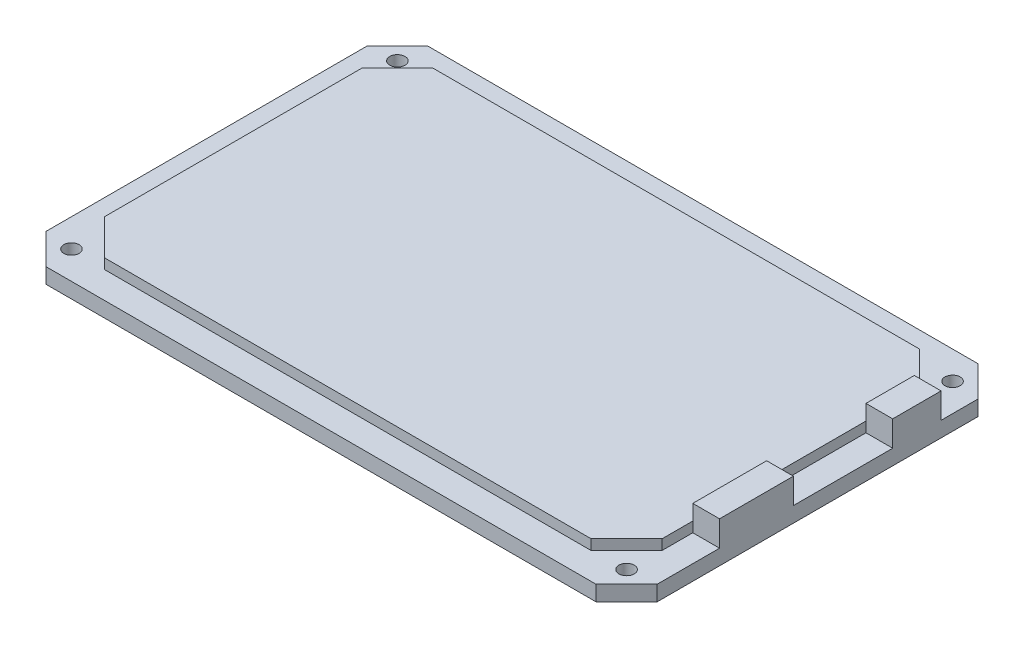
ISO-10303-21;
HEADER;
FILE_DESCRIPTION(('STEP AP214'),'2;1');
FILE_NAME('part.step','',(''),(''),'','','');
FILE_SCHEMA(('AUTOMOTIVE_DESIGN { 1 0 10303 214 1 1 1 1 }'));
ENDSEC;
DATA;
#1=APPLICATION_CONTEXT('core data for automotive mechanical design processes');
#2=APPLICATION_PROTOCOL_DEFINITION('international standard','automotive_design',2000,#1);
#3=PRODUCT_CONTEXT('',#1,'mechanical');
#4=PRODUCT('Part','Part','',(#3));
#5=PRODUCT_RELATED_PRODUCT_CATEGORY('part','',(#4));
#6=PRODUCT_DEFINITION_FORMATION('','',#4);
#7=PRODUCT_DEFINITION_CONTEXT('part definition',#1,'design');
#8=PRODUCT_DEFINITION('design','',#6,#7);
#9=PRODUCT_DEFINITION_SHAPE('','',#8);
#10=(LENGTH_UNIT() NAMED_UNIT(*) SI_UNIT(.MILLI.,.METRE.));
#11=(NAMED_UNIT(*) PLANE_ANGLE_UNIT() SI_UNIT($,.RADIAN.));
#12=(NAMED_UNIT(*) SI_UNIT($,.STERADIAN.) SOLID_ANGLE_UNIT());
#13=UNCERTAINTY_MEASURE_WITH_UNIT(LENGTH_MEASURE(1.E-05),#10,'distance_accuracy_value','');
#14=(GEOMETRIC_REPRESENTATION_CONTEXT(3) GLOBAL_UNCERTAINTY_ASSIGNED_CONTEXT((#13)) GLOBAL_UNIT_ASSIGNED_CONTEXT((#10,
#11,#12)) REPRESENTATION_CONTEXT('',''));
#15=CARTESIAN_POINT('',(0.,0.,0.));
#16=DIRECTION('',(0.,0.,1.));
#17=DIRECTION('',(1.,0.,0.));
#18=AXIS2_PLACEMENT_3D('',#15,#16,#17);
#19=CARTESIAN_POINT('',(0.,3.,0.));
#20=DIRECTION('',(0.,-1.,0.));
#21=DIRECTION('',(0.,0.,-1.));
#22=AXIS2_PLACEMENT_3D('',#19,#20,#21);
#23=PLANE('',#22);
#24=CARTESIAN_POINT('',(-54.5,3.,-32.));
#25=DIRECTION('',(0.,1.,0.));
#26=DIRECTION('',(0.,0.,1.));
#27=AXIS2_PLACEMENT_3D('',#24,#25,#26);
#28=CIRCLE('',#27,1.5);
#29=CARTESIAN_POINT('',(-54.5,3.,-30.5));
#30=VERTEX_POINT('',#29);
#31=EDGE_CURVE('E262',#30,#30,#28,.T.);
#32=ORIENTED_EDGE('',*,*,#31,.F.);
#33=EDGE_LOOP('',(#32));
#34=FACE_BOUND('',#33,.T.);
#35=CARTESIAN_POINT('',(54.5,3.,-32.));
#36=DIRECTION('',(0.,1.,0.));
#37=DIRECTION('',(0.,0.,1.));
#38=AXIS2_PLACEMENT_3D('',#35,#36,#37);
#39=CIRCLE('',#38,1.5);
#40=CARTESIAN_POINT('',(54.5,3.,-30.5));
#41=VERTEX_POINT('',#40);
#42=EDGE_CURVE('E266',#41,#41,#39,.T.);
#43=ORIENTED_EDGE('',*,*,#42,.F.);
#44=EDGE_LOOP('',(#43));
#45=FACE_BOUND('',#44,.T.);
#46=CARTESIAN_POINT('',(54.5,3.,32.));
#47=DIRECTION('',(0.,1.,0.));
#48=DIRECTION('',(0.,0.,1.));
#49=AXIS2_PLACEMENT_3D('',#46,#47,#48);
#50=CIRCLE('',#49,1.5);
#51=CARTESIAN_POINT('',(54.5,3.,33.5));
#52=VERTEX_POINT('',#51);
#53=EDGE_CURVE('E261',#52,#52,#50,.T.);
#54=ORIENTED_EDGE('',*,*,#53,.F.);
#55=EDGE_LOOP('',(#54));
#56=FACE_BOUND('',#55,.T.);
#57=CARTESIAN_POINT('',(-54.5,3.,32.));
#58=DIRECTION('',(0.,1.,0.));
#59=DIRECTION('',(0.,0.,1.));
#60=AXIS2_PLACEMENT_3D('',#57,#58,#59);
#61=CIRCLE('',#60,1.5);
#62=CARTESIAN_POINT('',(-54.5,3.,33.5));
#63=VERTEX_POINT('',#62);
#64=EDGE_CURVE('E271',#63,#63,#61,.T.);
#65=ORIENTED_EDGE('',*,*,#64,.F.);
#66=EDGE_LOOP('',(#65));
#67=FACE_BOUND('',#66,.T.);
#68=DIRECTION('',(1.,0.,0.));
#69=VECTOR('',#68,1.);
#70=CARTESIAN_POINT('',(54.75,3.,19.25));
#71=LINE('',#70,#69);
#72=CARTESIAN_POINT('',(54.75,3.,19.25));
#73=VERTEX_POINT('',#72);
#74=CARTESIAN_POINT('',(60.,3.,19.25));
#75=VERTEX_POINT('',#74);
#76=EDGE_CURVE('E459',#73,#75,#71,.T.);
#77=ORIENTED_EDGE('',*,*,#76,.F.);
#78=DIRECTION('',(0.,0.,-1.));
#79=VECTOR('',#78,1.);
#80=CARTESIAN_POINT('',(54.75,3.,32.25));
#81=LINE('',#80,#79);
#82=CARTESIAN_POINT('',(54.75,3.,25.25));
#83=VERTEX_POINT('',#82);
#84=EDGE_CURVE('E290',#83,#73,#81,.T.);
#85=ORIENTED_EDGE('',*,*,#84,.F.);
#86=DIRECTION('',(0.707106781186549,0.,-0.707106781186546));
#87=VECTOR('',#86,1.);
#88=CARTESIAN_POINT('',(39.9999999999999,3.,40.0000000000001));
#89=LINE('',#88,#87);
#90=CARTESIAN_POINT('',(47.75,3.,32.25));
#91=VERTEX_POINT('',#90);
#92=EDGE_CURVE('E11',#83,#91,#89,.F.);
#93=ORIENTED_EDGE('',*,*,#92,.T.);
#94=DIRECTION('',(1.,0.,0.));
#95=VECTOR('',#94,1.);
#96=CARTESIAN_POINT('',(-54.75,3.,32.25));
#97=LINE('',#96,#95);
#98=CARTESIAN_POINT('',(-47.75,3.,32.25));
#99=VERTEX_POINT('',#98);
#100=EDGE_CURVE('E301',#99,#91,#97,.T.);
#101=ORIENTED_EDGE('',*,*,#100,.F.);
#102=DIRECTION('',(0.707106781186546,0.,0.707106781186549));
#103=VECTOR('',#102,1.);
#104=CARTESIAN_POINT('',(-40.0000000000001,3.,39.9999999999999));
#105=LINE('',#104,#103);
#106=CARTESIAN_POINT('',(-54.75,3.,25.25));
#107=VERTEX_POINT('',#106);
#108=EDGE_CURVE('E42',#99,#107,#105,.F.);
#109=ORIENTED_EDGE('',*,*,#108,.T.);
#110=DIRECTION('',(0.,0.,1.));
#111=VECTOR('',#110,1.);
#112=CARTESIAN_POINT('',(-54.75,3.,32.25));
#113=LINE('',#112,#111);
#114=CARTESIAN_POINT('',(-54.75,3.,-25.25));
#115=VERTEX_POINT('',#114);
#116=EDGE_CURVE('E298',#115,#107,#113,.T.);
#117=ORIENTED_EDGE('',*,*,#116,.F.);
#118=DIRECTION('',(-0.707106781186549,0.,0.707106781186546));
#119=VECTOR('',#118,1.);
#120=CARTESIAN_POINT('',(-39.9999999999999,3.,-40.0000000000001));
#121=LINE('',#120,#119);
#122=CARTESIAN_POINT('',(-47.75,3.,-32.25));
#123=VERTEX_POINT('',#122);
#124=EDGE_CURVE('E399',#115,#123,#121,.F.);
#125=ORIENTED_EDGE('',*,*,#124,.T.);
#126=DIRECTION('',(-1.,0.,0.));
#127=VECTOR('',#126,1.);
#128=CARTESIAN_POINT('',(-54.75,3.,-32.25));
#129=LINE('',#128,#127);
#130=CARTESIAN_POINT('',(47.75,3.,-32.25));
#131=VERTEX_POINT('',#130);
#132=EDGE_CURVE('E293',#131,#123,#129,.T.);
#133=ORIENTED_EDGE('',*,*,#132,.F.);
#134=DIRECTION('',(-0.707106781186545,0.,-0.70710678118655));
#135=VECTOR('',#134,1.);
#136=CARTESIAN_POINT('',(40.0000000000002,3.,-39.9999999999999));
#137=LINE('',#136,#135);
#138=CARTESIAN_POINT('',(54.75,3.,-25.25));
#139=VERTEX_POINT('',#138);
#140=EDGE_CURVE('E396',#131,#139,#137,.F.);
#141=ORIENTED_EDGE('',*,*,#140,.T.);
#142=CARTESIAN_POINT('',(54.75,3.,-24.25));
#143=VERTEX_POINT('',#142);
#144=EDGE_CURVE('E295',#143,#139,#81,.T.);
#145=ORIENTED_EDGE('',*,*,#144,.F.);
#146=DIRECTION('',(-1.,0.,0.));
#147=VECTOR('',#146,1.);
#148=CARTESIAN_POINT('',(54.75,3.,-24.25));
#149=LINE('',#148,#147);
#150=CARTESIAN_POINT('',(60.,3.,-24.25));
#151=VERTEX_POINT('',#150);
#152=EDGE_CURVE('E235',#151,#143,#149,.T.);
#153=ORIENTED_EDGE('',*,*,#152,.F.);
#154=DIRECTION('',(0.,0.,-1.));
#155=VECTOR('',#154,1.);
#156=CARTESIAN_POINT('',(60.,3.,37.5));
#157=LINE('',#156,#155);
#158=CARTESIAN_POINT('',(60.,3.,-31.5));
#159=VERTEX_POINT('',#158);
#160=EDGE_CURVE('E310',#151,#159,#157,.T.);
#161=ORIENTED_EDGE('',*,*,#160,.T.);
#162=DIRECTION('',(0.707106781186547,0.,0.707106781186548));
#163=VECTOR('',#162,1.);
#164=CARTESIAN_POINT('',(54.,3.,-37.5));
#165=LINE('',#164,#163);
#166=CARTESIAN_POINT('',(54.,3.,-37.5));
#167=VERTEX_POINT('',#166);
#168=EDGE_CURVE('E352',#159,#167,#165,.F.);
#169=ORIENTED_EDGE('',*,*,#168,.T.);
#170=DIRECTION('',(-1.,0.,0.));
#171=VECTOR('',#170,1.);
#172=CARTESIAN_POINT('',(-60.,3.,-37.5));
#173=LINE('',#172,#171);
#174=CARTESIAN_POINT('',(-53.9999999999999,3.,-37.5));
#175=VERTEX_POINT('',#174);
#176=EDGE_CURVE('E308',#167,#175,#173,.T.);
#177=ORIENTED_EDGE('',*,*,#176,.T.);
#178=DIRECTION('',(0.707106781186548,0.,-0.707106781186547));
#179=VECTOR('',#178,1.);
#180=CARTESIAN_POINT('',(-60.,3.,-31.5));
#181=LINE('',#180,#179);
#182=CARTESIAN_POINT('',(-60.,3.,-31.5));
#183=VERTEX_POINT('',#182);
#184=EDGE_CURVE('E354',#175,#183,#181,.F.);
#185=ORIENTED_EDGE('',*,*,#184,.T.);
#186=DIRECTION('',(0.,0.,1.));
#187=VECTOR('',#186,1.);
#188=CARTESIAN_POINT('',(-60.,3.,37.5));
#189=LINE('',#188,#187);
#190=CARTESIAN_POINT('',(-60.,3.,31.5));
#191=VERTEX_POINT('',#190);
#192=EDGE_CURVE('E313',#183,#191,#189,.T.);
#193=ORIENTED_EDGE('',*,*,#192,.T.);
#194=DIRECTION('',(-0.707106781186547,0.,-0.707106781186548));
#195=VECTOR('',#194,1.);
#196=CARTESIAN_POINT('',(-53.9999999999999,3.,37.5));
#197=LINE('',#196,#195);
#198=CARTESIAN_POINT('',(-53.9999999999999,3.,37.5));
#199=VERTEX_POINT('',#198);
#200=EDGE_CURVE('E348',#191,#199,#197,.F.);
#201=ORIENTED_EDGE('',*,*,#200,.T.);
#202=DIRECTION('',(1.,0.,0.));
#203=VECTOR('',#202,1.);
#204=CARTESIAN_POINT('',(-60.,3.,37.5));
#205=LINE('',#204,#203);
#206=CARTESIAN_POINT('',(54.,3.,37.5));
#207=VERTEX_POINT('',#206);
#208=EDGE_CURVE('E316',#199,#207,#205,.T.);
#209=ORIENTED_EDGE('',*,*,#208,.T.);
#210=DIRECTION('',(-0.707106781186548,0.,0.707106781186547));
#211=VECTOR('',#210,1.);
#212=CARTESIAN_POINT('',(60.,3.,31.5));
#213=LINE('',#212,#211);
#214=CARTESIAN_POINT('',(60.,3.,31.5));
#215=VERTEX_POINT('',#214);
#216=EDGE_CURVE('E350',#207,#215,#213,.F.);
#217=ORIENTED_EDGE('',*,*,#216,.T.);
#218=EDGE_CURVE('E305',#215,#75,#157,.T.);
#219=ORIENTED_EDGE('',*,*,#218,.T.);
#220=EDGE_LOOP('',(#77,#85,#93,#101,#109,#117,#125,#133,#141,#145,#153,#161,#169,#177,#185,#193,
#201,#209,#217,#219));
#221=FACE_BOUND('',#220,.T.);
#222=ADVANCED_FACE('F33',(#34,#45,#56,#67,#221),#23,.F.);
#223=DIRECTION('',(-1.,0.,0.));
#224=VECTOR('',#223,1.);
#225=CARTESIAN_POINT('',(54.75,3.,4.75000000000003));
#226=LINE('',#225,#224);
#227=CARTESIAN_POINT('',(60.,3.,4.75000000000003));
#228=VERTEX_POINT('',#227);
#229=CARTESIAN_POINT('',(54.75,3.,4.75000000000003));
#230=VERTEX_POINT('',#229);
#231=EDGE_CURVE('E226',#228,#230,#226,.T.);
#232=ORIENTED_EDGE('',*,*,#231,.F.);
#233=CARTESIAN_POINT('',(60.,3.,-14.75));
#234=VERTEX_POINT('',#233);
#235=EDGE_CURVE('E309',#228,#234,#157,.T.);
#236=ORIENTED_EDGE('',*,*,#235,.T.);
#237=DIRECTION('',(1.,0.,0.));
#238=VECTOR('',#237,1.);
#239=CARTESIAN_POINT('',(54.75,3.,-14.75));
#240=LINE('',#239,#238);
#241=CARTESIAN_POINT('',(54.75,3.,-14.75));
#242=VERTEX_POINT('',#241);
#243=EDGE_CURVE('E231',#242,#234,#240,.T.);
#244=ORIENTED_EDGE('',*,*,#243,.F.);
#245=EDGE_CURVE('E294',#230,#242,#81,.T.);
#246=ORIENTED_EDGE('',*,*,#245,.F.);
#247=EDGE_LOOP('',(#232,#236,#244,#246));
#248=FACE_BOUND('',#247,.T.);
#249=ADVANCED_FACE('F530',(#248),#23,.F.);
#250=CARTESIAN_POINT('',(54.75,5.,32.25));
#251=DIRECTION('',(-1.,0.,0.));
#252=DIRECTION('',(0.,0.,1.));
#253=AXIS2_PLACEMENT_3D('',#250,#251,#252);
#254=PLANE('',#253);
#255=DIRECTION('',(0.,-1.,0.));
#256=VECTOR('',#255,1.);
#257=CARTESIAN_POINT('',(54.75,8.,19.25));
#258=LINE('',#257,#256);
#259=CARTESIAN_POINT('',(54.75,5.,19.25));
#260=VERTEX_POINT('',#259);
#261=EDGE_CURVE('E232',#260,#73,#258,.T.);
#262=ORIENTED_EDGE('',*,*,#261,.F.);
#263=DIRECTION('',(0.,0.,-1.));
#264=VECTOR('',#263,1.);
#265=CARTESIAN_POINT('',(54.75,5.,32.25));
#266=LINE('',#265,#264);
#267=CARTESIAN_POINT('',(54.75,5.,25.25));
#268=VERTEX_POINT('',#267);
#269=EDGE_CURVE('E275',#268,#260,#266,.T.);
#270=ORIENTED_EDGE('',*,*,#269,.F.);
#271=DIRECTION('',(0.,-1.,0.));
#272=VECTOR('',#271,1.);
#273=CARTESIAN_POINT('',(54.75,5.,25.25));
#274=LINE('',#273,#272);
#275=EDGE_CURVE('E372',#268,#83,#274,.T.);
#276=ORIENTED_EDGE('',*,*,#275,.T.);
#277=ORIENTED_EDGE('',*,*,#84,.T.);
#278=EDGE_LOOP('',(#262,#270,#276,#277));
#279=FACE_BOUND('',#278,.T.);
#280=ADVANCED_FACE('F526',(#279),#254,.F.);
#281=DIRECTION('',(0.,-1.,0.));
#282=VECTOR('',#281,1.);
#283=CARTESIAN_POINT('',(54.75,8.,4.75000000000003));
#284=LINE('',#283,#282);
#285=CARTESIAN_POINT('',(54.75,5.,4.75000000000003));
#286=VERTEX_POINT('',#285);
#287=EDGE_CURVE('E455',#286,#230,#284,.T.);
#288=ORIENTED_EDGE('',*,*,#287,.T.);
#289=ORIENTED_EDGE('',*,*,#245,.T.);
#290=DIRECTION('',(0.,-1.,0.));
#291=VECTOR('',#290,1.);
#292=CARTESIAN_POINT('',(54.75,8.,-14.75));
#293=LINE('',#292,#291);
#294=CARTESIAN_POINT('',(54.75,5.,-14.75));
#295=VERTEX_POINT('',#294);
#296=EDGE_CURVE('E257',#295,#242,#293,.T.);
#297=ORIENTED_EDGE('',*,*,#296,.F.);
#298=EDGE_CURVE('E279',#286,#295,#266,.T.);
#299=ORIENTED_EDGE('',*,*,#298,.F.);
#300=EDGE_LOOP('',(#288,#289,#297,#299));
#301=FACE_BOUND('',#300,.T.);
#302=ADVANCED_FACE('F469',(#301),#254,.F.);
#303=DIRECTION('',(0.,-1.,0.));
#304=VECTOR('',#303,1.);
#305=CARTESIAN_POINT('',(54.75,8.,-24.25));
#306=LINE('',#305,#304);
#307=CARTESIAN_POINT('',(54.75,5.,-24.25));
#308=VERTEX_POINT('',#307);
#309=EDGE_CURVE('E248',#308,#143,#306,.T.);
#310=ORIENTED_EDGE('',*,*,#309,.T.);
#311=ORIENTED_EDGE('',*,*,#144,.T.);
#312=DIRECTION('',(0.,1.,0.));
#313=VECTOR('',#312,1.);
#314=CARTESIAN_POINT('',(54.75,5.,-25.25));
#315=LINE('',#314,#313);
#316=CARTESIAN_POINT('',(54.75,5.,-25.25));
#317=VERTEX_POINT('',#316);
#318=EDGE_CURVE('E375',#139,#317,#315,.T.);
#319=ORIENTED_EDGE('',*,*,#318,.T.);
#320=EDGE_CURVE('E304',#308,#317,#266,.T.);
#321=ORIENTED_EDGE('',*,*,#320,.F.);
#322=EDGE_LOOP('',(#310,#311,#319,#321));
#323=FACE_BOUND('',#322,.T.);
#324=ADVANCED_FACE('F493',(#323),#254,.F.);
#325=CARTESIAN_POINT('',(60.,3.,37.5));
#326=DIRECTION('',(-1.,0.,0.));
#327=DIRECTION('',(0.,0.,1.));
#328=AXIS2_PLACEMENT_3D('',#325,#326,#327);
#329=PLANE('',#328);
#330=DIRECTION('',(0.,0.,-1.));
#331=VECTOR('',#330,1.);
#332=CARTESIAN_POINT('',(60.,0.,37.5));
#333=LINE('',#332,#331);
#334=CARTESIAN_POINT('',(60.,0.,31.5));
#335=VERTEX_POINT('',#334);
#336=CARTESIAN_POINT('',(60.,0.,-31.5));
#337=VERTEX_POINT('',#336);
#338=EDGE_CURVE('E289',#335,#337,#333,.T.);
#339=ORIENTED_EDGE('',*,*,#338,.T.);
#340=DIRECTION('',(0.,1.,0.));
#341=VECTOR('',#340,1.);
#342=CARTESIAN_POINT('',(60.,3.,-31.5));
#343=LINE('',#342,#341);
#344=EDGE_CURVE('E359',#337,#159,#343,.T.);
#345=ORIENTED_EDGE('',*,*,#344,.T.);
#346=ORIENTED_EDGE('',*,*,#160,.F.);
#347=DIRECTION('',(0.,-1.,0.));
#348=VECTOR('',#347,1.);
#349=CARTESIAN_POINT('',(60.,8.,-24.25));
#350=LINE('',#349,#348);
#351=CARTESIAN_POINT('',(60.,8.,-24.25));
#352=VERTEX_POINT('',#351);
#353=EDGE_CURVE('E252',#352,#151,#350,.T.);
#354=ORIENTED_EDGE('',*,*,#353,.F.);
#355=DIRECTION('',(0.,0.,-1.));
#356=VECTOR('',#355,1.);
#357=CARTESIAN_POINT('',(60.,8.,-24.25));
#358=LINE('',#357,#356);
#359=CARTESIAN_POINT('',(60.,8.,-14.75));
#360=VERTEX_POINT('',#359);
#361=EDGE_CURVE('E245',#360,#352,#358,.T.);
#362=ORIENTED_EDGE('',*,*,#361,.F.);
#363=DIRECTION('',(0.,-1.,0.));
#364=VECTOR('',#363,1.);
#365=CARTESIAN_POINT('',(60.,8.,-14.75));
#366=LINE('',#365,#364);
#367=EDGE_CURVE('E254',#360,#234,#366,.T.);
#368=ORIENTED_EDGE('',*,*,#367,.T.);
#369=ORIENTED_EDGE('',*,*,#235,.F.);
#370=DIRECTION('',(0.,-1.,0.));
#371=VECTOR('',#370,1.);
#372=CARTESIAN_POINT('',(60.,8.,4.75000000000003));
#373=LINE('',#372,#371);
#374=CARTESIAN_POINT('',(60.,8.,4.75000000000003));
#375=VERTEX_POINT('',#374);
#376=EDGE_CURVE('E452',#375,#228,#373,.T.);
#377=ORIENTED_EDGE('',*,*,#376,.F.);
#378=DIRECTION('',(0.,0.,-1.));
#379=VECTOR('',#378,1.);
#380=CARTESIAN_POINT('',(60.,8.,4.75000000000003));
#381=LINE('',#380,#379);
#382=CARTESIAN_POINT('',(60.,8.,19.25));
#383=VERTEX_POINT('',#382);
#384=EDGE_CURVE('E220',#383,#375,#381,.T.);
#385=ORIENTED_EDGE('',*,*,#384,.F.);
#386=DIRECTION('',(0.,-1.,0.));
#387=VECTOR('',#386,1.);
#388=CARTESIAN_POINT('',(60.,8.,19.25));
#389=LINE('',#388,#387);
#390=EDGE_CURVE('E217',#383,#75,#389,.T.);
#391=ORIENTED_EDGE('',*,*,#390,.T.);
#392=ORIENTED_EDGE('',*,*,#218,.F.);
#393=DIRECTION('',(0.,-1.,0.));
#394=VECTOR('',#393,1.);
#395=CARTESIAN_POINT('',(60.,3.,31.5));
#396=LINE('',#395,#394);
#397=EDGE_CURVE('E356',#215,#335,#396,.T.);
#398=ORIENTED_EDGE('',*,*,#397,.T.);
#399=EDGE_LOOP('',(#339,#345,#346,#354,#362,#368,#369,#377,#385,#391,#392,#398));
#400=FACE_BOUND('',#399,.T.);
#401=ADVANCED_FACE('F449',(#400),#329,.F.);
#402=CARTESIAN_POINT('',(-60.,3.,-37.5));
#403=DIRECTION('',(0.,0.,1.));
#404=DIRECTION('',(1.,0.,0.));
#405=AXIS2_PLACEMENT_3D('',#402,#403,#404);
#406=PLANE('',#405);
#407=DIRECTION('',(-1.,0.,0.));
#408=VECTOR('',#407,1.);
#409=CARTESIAN_POINT('',(-60.,0.,-37.5));
#410=LINE('',#409,#408);
#411=CARTESIAN_POINT('',(54.,0.,-37.5));
#412=VERTEX_POINT('',#411);
#413=CARTESIAN_POINT('',(-53.9999999999999,0.,-37.5));
#414=VERTEX_POINT('',#413);
#415=EDGE_CURVE('E322',#412,#414,#410,.T.);
#416=ORIENTED_EDGE('',*,*,#415,.T.);
#417=DIRECTION('',(0.,1.,0.));
#418=VECTOR('',#417,1.);
#419=CARTESIAN_POINT('',(-53.9999999999999,3.,-37.5));
#420=LINE('',#419,#418);
#421=EDGE_CURVE('E346',#414,#175,#420,.T.);
#422=ORIENTED_EDGE('',*,*,#421,.T.);
#423=ORIENTED_EDGE('',*,*,#176,.F.);
#424=DIRECTION('',(0.,-1.,0.));
#425=VECTOR('',#424,1.);
#426=CARTESIAN_POINT('',(54.,3.,-37.5));
#427=LINE('',#426,#425);
#428=EDGE_CURVE('E343',#167,#412,#427,.T.);
#429=ORIENTED_EDGE('',*,*,#428,.T.);
#430=EDGE_LOOP('',(#416,#422,#423,#429));
#431=FACE_BOUND('',#430,.T.);
#432=ADVANCED_FACE('F538',(#431),#406,.F.);
#433=CARTESIAN_POINT('',(-60.,3.,37.5));
#434=DIRECTION('',(1.,0.,0.));
#435=DIRECTION('',(0.,0.,-1.));
#436=AXIS2_PLACEMENT_3D('',#433,#434,#435);
#437=PLANE('',#436);
#438=ORIENTED_EDGE('',*,*,#192,.F.);
#439=DIRECTION('',(0.,-1.,0.));
#440=VECTOR('',#439,1.);
#441=CARTESIAN_POINT('',(-60.,3.,-31.5));
#442=LINE('',#441,#440);
#443=CARTESIAN_POINT('',(-60.,0.,-31.5));
#444=VERTEX_POINT('',#443);
#445=EDGE_CURVE('E332',#183,#444,#442,.T.);
#446=ORIENTED_EDGE('',*,*,#445,.T.);
#447=DIRECTION('',(0.,0.,1.));
#448=VECTOR('',#447,1.);
#449=CARTESIAN_POINT('',(-60.,0.,37.5));
#450=LINE('',#449,#448);
#451=CARTESIAN_POINT('',(-60.,0.,31.5));
#452=VERTEX_POINT('',#451);
#453=EDGE_CURVE('E325',#444,#452,#450,.T.);
#454=ORIENTED_EDGE('',*,*,#453,.T.);
#455=DIRECTION('',(0.,1.,0.));
#456=VECTOR('',#455,1.);
#457=CARTESIAN_POINT('',(-60.,3.,31.5));
#458=LINE('',#457,#456);
#459=EDGE_CURVE('E319',#452,#191,#458,.T.);
#460=ORIENTED_EDGE('',*,*,#459,.T.);
#461=EDGE_LOOP('',(#438,#446,#454,#460));
#462=FACE_BOUND('',#461,.T.);
#463=ADVANCED_FACE('F432',(#462),#437,.F.);
#464=CARTESIAN_POINT('',(-60.,3.,37.5));
#465=DIRECTION('',(0.,0.,-1.));
#466=DIRECTION('',(-1.,0.,0.));
#467=AXIS2_PLACEMENT_3D('',#464,#465,#466);
#468=PLANE('',#467);
#469=DIRECTION('',(1.,0.,0.));
#470=VECTOR('',#469,1.);
#471=CARTESIAN_POINT('',(-60.,0.,37.5));
#472=LINE('',#471,#470);
#473=CARTESIAN_POINT('',(-53.9999999999999,0.,37.5));
#474=VERTEX_POINT('',#473);
#475=CARTESIAN_POINT('',(54.,0.,37.5));
#476=VERTEX_POINT('',#475);
#477=EDGE_CURVE('E328',#474,#476,#472,.T.);
#478=ORIENTED_EDGE('',*,*,#477,.T.);
#479=DIRECTION('',(0.,1.,0.));
#480=VECTOR('',#479,1.);
#481=CARTESIAN_POINT('',(54.,3.,37.5));
#482=LINE('',#481,#480);
#483=EDGE_CURVE('E365',#476,#207,#482,.T.);
#484=ORIENTED_EDGE('',*,*,#483,.T.);
#485=ORIENTED_EDGE('',*,*,#208,.F.);
#486=DIRECTION('',(0.,-1.,0.));
#487=VECTOR('',#486,1.);
#488=CARTESIAN_POINT('',(-53.9999999999999,3.,37.5));
#489=LINE('',#488,#487);
#490=EDGE_CURVE('E362',#199,#474,#489,.T.);
#491=ORIENTED_EDGE('',*,*,#490,.T.);
#492=EDGE_LOOP('',(#478,#484,#485,#491));
#493=FACE_BOUND('',#492,.T.);
#494=ADVANCED_FACE('F419',(#493),#468,.F.);
#495=CARTESIAN_POINT('',(0.,0.,0.));
#496=DIRECTION('',(0.,-1.,0.));
#497=DIRECTION('',(0.,0.,-1.));
#498=AXIS2_PLACEMENT_3D('',#495,#496,#497);
#499=PLANE('',#498);
#500=CARTESIAN_POINT('',(-54.5,0.,-32.));
#501=DIRECTION('',(0.,-1.,0.));
#502=DIRECTION('',(0.,0.,-1.));
#503=AXIS2_PLACEMENT_3D('',#500,#501,#502);
#504=CIRCLE('',#503,1.5);
#505=CARTESIAN_POINT('',(-54.5,0.,-33.5));
#506=VERTEX_POINT('',#505);
#507=EDGE_CURVE('E37',#506,#506,#504,.T.);
#508=ORIENTED_EDGE('',*,*,#507,.F.);
#509=EDGE_LOOP('',(#508));
#510=FACE_BOUND('',#509,.T.);
#511=CARTESIAN_POINT('',(54.5,0.,-32.));
#512=DIRECTION('',(0.,-1.,0.));
#513=DIRECTION('',(0.,0.,-1.));
#514=AXIS2_PLACEMENT_3D('',#511,#512,#513);
#515=CIRCLE('',#514,1.5);
#516=CARTESIAN_POINT('',(54.5,0.,-33.5));
#517=VERTEX_POINT('',#516);
#518=EDGE_CURVE('E405',#517,#517,#515,.T.);
#519=ORIENTED_EDGE('',*,*,#518,.F.);
#520=EDGE_LOOP('',(#519));
#521=FACE_BOUND('',#520,.T.);
#522=CARTESIAN_POINT('',(54.5,0.,32.));
#523=DIRECTION('',(0.,-1.,0.));
#524=DIRECTION('',(0.,0.,-1.));
#525=AXIS2_PLACEMENT_3D('',#522,#523,#524);
#526=CIRCLE('',#525,1.5);
#527=CARTESIAN_POINT('',(54.5,0.,30.5));
#528=VERTEX_POINT('',#527);
#529=EDGE_CURVE('E265',#528,#528,#526,.T.);
#530=ORIENTED_EDGE('',*,*,#529,.F.);
#531=EDGE_LOOP('',(#530));
#532=FACE_BOUND('',#531,.T.);
#533=CARTESIAN_POINT('',(-54.5,0.,32.));
#534=DIRECTION('',(0.,-1.,0.));
#535=DIRECTION('',(0.,0.,-1.));
#536=AXIS2_PLACEMENT_3D('',#533,#534,#535);
#537=CIRCLE('',#536,1.5);
#538=CARTESIAN_POINT('',(-54.5,0.,30.5));
#539=VERTEX_POINT('',#538);
#540=EDGE_CURVE('E274',#539,#539,#537,.T.);
#541=ORIENTED_EDGE('',*,*,#540,.F.);
#542=EDGE_LOOP('',(#541));
#543=FACE_BOUND('',#542,.T.);
#544=ORIENTED_EDGE('',*,*,#453,.F.);
#545=DIRECTION('',(-0.707106781186548,0.,0.707106781186547));
#546=VECTOR('',#545,1.);
#547=CARTESIAN_POINT('',(-45.7499999999999,0.,-45.75));
#548=LINE('',#547,#546);
#549=EDGE_CURVE('E341',#444,#414,#548,.F.);
#550=ORIENTED_EDGE('',*,*,#549,.T.);
#551=ORIENTED_EDGE('',*,*,#415,.F.);
#552=DIRECTION('',(-0.707106781186547,0.,-0.707106781186548));
#553=VECTOR('',#552,1.);
#554=CARTESIAN_POINT('',(45.7500000000001,0.,-45.75));
#555=LINE('',#554,#553);
#556=EDGE_CURVE('E339',#412,#337,#555,.F.);
#557=ORIENTED_EDGE('',*,*,#556,.T.);
#558=ORIENTED_EDGE('',*,*,#338,.F.);
#559=DIRECTION('',(0.707106781186548,0.,-0.707106781186547));
#560=VECTOR('',#559,1.);
#561=CARTESIAN_POINT('',(45.7499999999999,0.,45.75));
#562=LINE('',#561,#560);
#563=EDGE_CURVE('E337',#335,#476,#562,.F.);
#564=ORIENTED_EDGE('',*,*,#563,.T.);
#565=ORIENTED_EDGE('',*,*,#477,.F.);
#566=DIRECTION('',(0.707106781186547,0.,0.707106781186548));
#567=VECTOR('',#566,1.);
#568=CARTESIAN_POINT('',(-45.75,0.,45.7499999999999));
#569=LINE('',#568,#567);
#570=EDGE_CURVE('E335',#474,#452,#569,.F.);
#571=ORIENTED_EDGE('',*,*,#570,.T.);
#572=EDGE_LOOP('',(#544,#550,#551,#557,#558,#564,#565,#571));
#573=FACE_BOUND('',#572,.T.);
#574=ADVANCED_FACE('F415',(#510,#521,#532,#543,#573),#499,.T.);
#575=CARTESIAN_POINT('',(-60.,3.,-31.5));
#576=DIRECTION('',(0.707106781186547,0.,0.707106781186548));
#577=DIRECTION('',(0.,-1.,0.));
#578=AXIS2_PLACEMENT_3D('',#575,#576,#577);
#579=PLANE('',#578);
#580=ORIENTED_EDGE('',*,*,#184,.F.);
#581=ORIENTED_EDGE('',*,*,#421,.F.);
#582=ORIENTED_EDGE('',*,*,#549,.F.);
#583=ORIENTED_EDGE('',*,*,#445,.F.);
#584=EDGE_LOOP('',(#580,#581,#582,#583));
#585=FACE_BOUND('',#584,.T.);
#586=ADVANCED_FACE('F418',(#585),#579,.F.);
#587=CARTESIAN_POINT('',(54.,3.,-37.5));
#588=DIRECTION('',(-0.707106781186548,0.,0.707106781186547));
#589=DIRECTION('',(0.,-1.,0.));
#590=AXIS2_PLACEMENT_3D('',#587,#588,#589);
#591=PLANE('',#590);
#592=ORIENTED_EDGE('',*,*,#168,.F.);
#593=ORIENTED_EDGE('',*,*,#344,.F.);
#594=ORIENTED_EDGE('',*,*,#556,.F.);
#595=ORIENTED_EDGE('',*,*,#428,.F.);
#596=EDGE_LOOP('',(#592,#593,#594,#595));
#597=FACE_BOUND('',#596,.T.);
#598=ADVANCED_FACE('F540',(#597),#591,.F.);
#599=CARTESIAN_POINT('',(60.,3.,31.5));
#600=DIRECTION('',(-0.707106781186547,0.,-0.707106781186548));
#601=DIRECTION('',(0.,-1.,0.));
#602=AXIS2_PLACEMENT_3D('',#599,#600,#601);
#603=PLANE('',#602);
#604=ORIENTED_EDGE('',*,*,#216,.F.);
#605=ORIENTED_EDGE('',*,*,#483,.F.);
#606=ORIENTED_EDGE('',*,*,#563,.F.);
#607=ORIENTED_EDGE('',*,*,#397,.F.);
#608=EDGE_LOOP('',(#604,#605,#606,#607));
#609=FACE_BOUND('',#608,.T.);
#610=ADVANCED_FACE('F445',(#609),#603,.F.);
#611=CARTESIAN_POINT('',(-53.9999999999999,3.,37.5));
#612=DIRECTION('',(0.707106781186548,0.,-0.707106781186547));
#613=DIRECTION('',(0.,-1.,0.));
#614=AXIS2_PLACEMENT_3D('',#611,#612,#613);
#615=PLANE('',#614);
#616=ORIENTED_EDGE('',*,*,#200,.F.);
#617=ORIENTED_EDGE('',*,*,#459,.F.);
#618=ORIENTED_EDGE('',*,*,#570,.F.);
#619=ORIENTED_EDGE('',*,*,#490,.F.);
#620=EDGE_LOOP('',(#616,#617,#618,#619));
#621=FACE_BOUND('',#620,.T.);
#622=ADVANCED_FACE('F436',(#621),#615,.F.);
#623=CARTESIAN_POINT('',(-54.75,5.,-32.25));
#624=DIRECTION('',(0.,0.,1.));
#625=DIRECTION('',(1.,0.,0.));
#626=AXIS2_PLACEMENT_3D('',#623,#624,#625);
#627=PLANE('',#626);
#628=DIRECTION('',(-1.,0.,0.));
#629=VECTOR('',#628,1.);
#630=CARTESIAN_POINT('',(-54.75,5.,-32.25));
#631=LINE('',#630,#629);
#632=CARTESIAN_POINT('',(47.75,5.,-32.25));
#633=VERTEX_POINT('',#632);
#634=CARTESIAN_POINT('',(-47.75,5.,-32.25));
#635=VERTEX_POINT('',#634);
#636=EDGE_CURVE('E278',#633,#635,#631,.T.);
#637=ORIENTED_EDGE('',*,*,#636,.F.);
#638=DIRECTION('',(0.,-1.,0.));
#639=VECTOR('',#638,1.);
#640=CARTESIAN_POINT('',(47.75,5.,-32.25));
#641=LINE('',#640,#639);
#642=EDGE_CURVE('E369',#633,#131,#641,.T.);
#643=ORIENTED_EDGE('',*,*,#642,.T.);
#644=ORIENTED_EDGE('',*,*,#132,.T.);
#645=DIRECTION('',(0.,1.,0.));
#646=VECTOR('',#645,1.);
#647=CARTESIAN_POINT('',(-47.75,5.,-32.25));
#648=LINE('',#647,#646);
#649=EDGE_CURVE('E367',#123,#635,#648,.T.);
#650=ORIENTED_EDGE('',*,*,#649,.T.);
#651=EDGE_LOOP('',(#637,#643,#644,#650));
#652=FACE_BOUND('',#651,.T.);
#653=ADVANCED_FACE('F502',(#652),#627,.F.);
#654=CARTESIAN_POINT('',(-54.75,5.,32.25));
#655=DIRECTION('',(1.,0.,0.));
#656=DIRECTION('',(0.,0.,-1.));
#657=AXIS2_PLACEMENT_3D('',#654,#655,#656);
#658=PLANE('',#657);
#659=DIRECTION('',(0.,0.,1.));
#660=VECTOR('',#659,1.);
#661=CARTESIAN_POINT('',(-54.75,5.,32.25));
#662=LINE('',#661,#660);
#663=CARTESIAN_POINT('',(-54.75,5.,-25.25));
#664=VERTEX_POINT('',#663);
#665=CARTESIAN_POINT('',(-54.75,5.,25.25));
#666=VERTEX_POINT('',#665);
#667=EDGE_CURVE('E283',#664,#666,#662,.T.);
#668=ORIENTED_EDGE('',*,*,#667,.F.);
#669=DIRECTION('',(0.,-1.,0.));
#670=VECTOR('',#669,1.);
#671=CARTESIAN_POINT('',(-54.75,5.,-25.25));
#672=LINE('',#671,#670);
#673=EDGE_CURVE('E388',#664,#115,#672,.T.);
#674=ORIENTED_EDGE('',*,*,#673,.T.);
#675=ORIENTED_EDGE('',*,*,#116,.T.);
#676=DIRECTION('',(0.,1.,0.));
#677=VECTOR('',#676,1.);
#678=CARTESIAN_POINT('',(-54.75,5.,25.25));
#679=LINE('',#678,#677);
#680=EDGE_CURVE('E386',#107,#666,#679,.T.);
#681=ORIENTED_EDGE('',*,*,#680,.T.);
#682=EDGE_LOOP('',(#668,#674,#675,#681));
#683=FACE_BOUND('',#682,.T.);
#684=ADVANCED_FACE('F511',(#683),#658,.F.);
#685=CARTESIAN_POINT('',(-54.75,5.,32.25));
#686=DIRECTION('',(0.,0.,-1.));
#687=DIRECTION('',(-1.,0.,0.));
#688=AXIS2_PLACEMENT_3D('',#685,#686,#687);
#689=PLANE('',#688);
#690=DIRECTION('',(1.,0.,0.));
#691=VECTOR('',#690,1.);
#692=CARTESIAN_POINT('',(-54.75,5.,32.25));
#693=LINE('',#692,#691);
#694=CARTESIAN_POINT('',(-47.75,5.,32.25));
#695=VERTEX_POINT('',#694);
#696=CARTESIAN_POINT('',(47.75,5.,32.25));
#697=VERTEX_POINT('',#696);
#698=EDGE_CURVE('E286',#695,#697,#693,.T.);
#699=ORIENTED_EDGE('',*,*,#698,.F.);
#700=DIRECTION('',(0.,-1.,0.));
#701=VECTOR('',#700,1.);
#702=CARTESIAN_POINT('',(-47.75,5.,32.25));
#703=LINE('',#702,#701);
#704=EDGE_CURVE('E393',#695,#99,#703,.T.);
#705=ORIENTED_EDGE('',*,*,#704,.T.);
#706=ORIENTED_EDGE('',*,*,#100,.T.);
#707=DIRECTION('',(0.,1.,0.));
#708=VECTOR('',#707,1.);
#709=CARTESIAN_POINT('',(47.75,5.,32.25));
#710=LINE('',#709,#708);
#711=EDGE_CURVE('E391',#91,#697,#710,.T.);
#712=ORIENTED_EDGE('',*,*,#711,.T.);
#713=EDGE_LOOP('',(#699,#705,#706,#712));
#714=FACE_BOUND('',#713,.T.);
#715=ADVANCED_FACE('F520',(#714),#689,.F.);
#716=CARTESIAN_POINT('',(0.,5.,0.));
#717=DIRECTION('',(0.,-1.,0.));
#718=DIRECTION('',(0.,0.,-1.));
#719=AXIS2_PLACEMENT_3D('',#716,#717,#718);
#720=PLANE('',#719);
#721=ORIENTED_EDGE('',*,*,#269,.T.);
#722=EDGE_CURVE('E230',#260,#286,#266,.T.);
#723=ORIENTED_EDGE('',*,*,#722,.T.);
#724=ORIENTED_EDGE('',*,*,#298,.T.);
#725=EDGE_CURVE('E280',#295,#308,#266,.T.);
#726=ORIENTED_EDGE('',*,*,#725,.T.);
#727=ORIENTED_EDGE('',*,*,#320,.T.);
#728=DIRECTION('',(0.707106781186545,0.,0.70710678118655));
#729=VECTOR('',#728,1.);
#730=CARTESIAN_POINT('',(47.75,5.,-32.25));
#731=LINE('',#730,#729);
#732=EDGE_CURVE('E384',#317,#633,#731,.F.);
#733=ORIENTED_EDGE('',*,*,#732,.T.);
#734=ORIENTED_EDGE('',*,*,#636,.T.);
#735=DIRECTION('',(0.707106781186549,0.,-0.707106781186546));
#736=VECTOR('',#735,1.);
#737=CARTESIAN_POINT('',(-54.75,5.,-25.25));
#738=LINE('',#737,#736);
#739=EDGE_CURVE('E382',#635,#664,#738,.F.);
#740=ORIENTED_EDGE('',*,*,#739,.T.);
#741=ORIENTED_EDGE('',*,*,#667,.T.);
#742=DIRECTION('',(-0.707106781186546,0.,-0.707106781186549));
#743=VECTOR('',#742,1.);
#744=CARTESIAN_POINT('',(-47.75,5.,32.25));
#745=LINE('',#744,#743);
#746=EDGE_CURVE('E380',#666,#695,#745,.F.);
#747=ORIENTED_EDGE('',*,*,#746,.T.);
#748=ORIENTED_EDGE('',*,*,#698,.T.);
#749=DIRECTION('',(-0.707106781186549,0.,0.707106781186546));
#750=VECTOR('',#749,1.);
#751=CARTESIAN_POINT('',(54.75,5.,25.25));
#752=LINE('',#751,#750);
#753=EDGE_CURVE('E378',#697,#268,#752,.F.);
#754=ORIENTED_EDGE('',*,*,#753,.T.);
#755=EDGE_LOOP('',(#721,#723,#724,#726,#727,#733,#734,#740,#741,#747,#748,#754));
#756=FACE_BOUND('',#755,.T.);
#757=ADVANCED_FACE('F473',(#756),#720,.F.);
#758=CARTESIAN_POINT('',(47.75,5.,-32.25));
#759=DIRECTION('',(-0.70710678118655,0.,0.707106781186545));
#760=DIRECTION('',(0.,-1.,0.));
#761=AXIS2_PLACEMENT_3D('',#758,#759,#760);
#762=PLANE('',#761);
#763=ORIENTED_EDGE('',*,*,#732,.F.);
#764=ORIENTED_EDGE('',*,*,#318,.F.);
#765=ORIENTED_EDGE('',*,*,#140,.F.);
#766=ORIENTED_EDGE('',*,*,#642,.F.);
#767=EDGE_LOOP('',(#763,#764,#765,#766));
#768=FACE_BOUND('',#767,.T.);
#769=ADVANCED_FACE('F498',(#768),#762,.F.);
#770=CARTESIAN_POINT('',(-54.75,5.,-25.25));
#771=DIRECTION('',(0.707106781186546,0.,0.707106781186549));
#772=DIRECTION('',(0.,-1.,0.));
#773=AXIS2_PLACEMENT_3D('',#770,#771,#772);
#774=PLANE('',#773);
#775=ORIENTED_EDGE('',*,*,#739,.F.);
#776=ORIENTED_EDGE('',*,*,#649,.F.);
#777=ORIENTED_EDGE('',*,*,#124,.F.);
#778=ORIENTED_EDGE('',*,*,#673,.F.);
#779=EDGE_LOOP('',(#775,#776,#777,#778));
#780=FACE_BOUND('',#779,.T.);
#781=ADVANCED_FACE('F506',(#780),#774,.F.);
#782=CARTESIAN_POINT('',(-47.75,5.,32.25));
#783=DIRECTION('',(0.707106781186549,0.,-0.707106781186546));
#784=DIRECTION('',(0.,-1.,0.));
#785=AXIS2_PLACEMENT_3D('',#782,#783,#784);
#786=PLANE('',#785);
#787=ORIENTED_EDGE('',*,*,#746,.F.);
#788=ORIENTED_EDGE('',*,*,#680,.F.);
#789=ORIENTED_EDGE('',*,*,#108,.F.);
#790=ORIENTED_EDGE('',*,*,#704,.F.);
#791=EDGE_LOOP('',(#787,#788,#789,#790));
#792=FACE_BOUND('',#791,.T.);
#793=ADVANCED_FACE('F515',(#792),#786,.F.);
#794=CARTESIAN_POINT('',(54.75,5.,25.25));
#795=DIRECTION('',(-0.707106781186546,0.,-0.707106781186549));
#796=DIRECTION('',(0.,-1.,0.));
#797=AXIS2_PLACEMENT_3D('',#794,#795,#796);
#798=PLANE('',#797);
#799=ORIENTED_EDGE('',*,*,#753,.F.);
#800=ORIENTED_EDGE('',*,*,#711,.F.);
#801=ORIENTED_EDGE('',*,*,#92,.F.);
#802=ORIENTED_EDGE('',*,*,#275,.F.);
#803=EDGE_LOOP('',(#799,#800,#801,#802));
#804=FACE_BOUND('',#803,.T.);
#805=ADVANCED_FACE('F35',(#804),#798,.F.);
#806=CARTESIAN_POINT('',(-54.5,-2.,32.));
#807=DIRECTION('',(0.,1.,0.));
#808=DIRECTION('',(0.,0.,1.));
#809=AXIS2_PLACEMENT_3D('',#806,#807,#808);
#810=CYLINDRICAL_SURFACE('',#809,1.5);
#811=ORIENTED_EDGE('',*,*,#540,.T.);
#812=EDGE_LOOP('',(#811));
#813=FACE_BOUND('',#812,.T.);
#814=ORIENTED_EDGE('',*,*,#64,.T.);
#815=EDGE_LOOP('',(#814));
#816=FACE_BOUND('',#815,.T.);
#817=ADVANCED_FACE('F680',(#813,#816),#810,.F.);
#818=CARTESIAN_POINT('',(54.5,-2.,32.));
#819=DIRECTION('',(0.,1.,0.));
#820=DIRECTION('',(0.,0.,1.));
#821=AXIS2_PLACEMENT_3D('',#818,#819,#820);
#822=CYLINDRICAL_SURFACE('',#821,1.5);
#823=ORIENTED_EDGE('',*,*,#529,.T.);
#824=EDGE_LOOP('',(#823));
#825=FACE_BOUND('',#824,.T.);
#826=ORIENTED_EDGE('',*,*,#53,.T.);
#827=EDGE_LOOP('',(#826));
#828=FACE_BOUND('',#827,.T.);
#829=ADVANCED_FACE('F677',(#825,#828),#822,.F.);
#830=CARTESIAN_POINT('',(54.5,-2.,-32.));
#831=DIRECTION('',(0.,1.,0.));
#832=DIRECTION('',(0.,0.,1.));
#833=AXIS2_PLACEMENT_3D('',#830,#831,#832);
#834=CYLINDRICAL_SURFACE('',#833,1.5);
#835=ORIENTED_EDGE('',*,*,#518,.T.);
#836=EDGE_LOOP('',(#835));
#837=FACE_BOUND('',#836,.T.);
#838=ORIENTED_EDGE('',*,*,#42,.T.);
#839=EDGE_LOOP('',(#838));
#840=FACE_BOUND('',#839,.T.);
#841=ADVANCED_FACE('F674',(#837,#840),#834,.F.);
#842=CARTESIAN_POINT('',(-54.5,-2.,-32.));
#843=DIRECTION('',(0.,1.,0.));
#844=DIRECTION('',(0.,0.,1.));
#845=AXIS2_PLACEMENT_3D('',#842,#843,#844);
#846=CYLINDRICAL_SURFACE('',#845,1.5);
#847=ORIENTED_EDGE('',*,*,#507,.T.);
#848=EDGE_LOOP('',(#847));
#849=FACE_BOUND('',#848,.T.);
#850=ORIENTED_EDGE('',*,*,#31,.T.);
#851=EDGE_LOOP('',(#850));
#852=FACE_BOUND('',#851,.T.);
#853=ADVANCED_FACE('F412',(#849,#852),#846,.F.);
#854=CARTESIAN_POINT('',(54.75,8.,-24.25));
#855=DIRECTION('',(1.,0.,0.));
#856=DIRECTION('',(0.,0.,-1.));
#857=AXIS2_PLACEMENT_3D('',#854,#855,#856);
#858=PLANE('',#857);
#859=CARTESIAN_POINT('',(54.75,8.,-24.25));
#860=VERTEX_POINT('',#859);
#861=EDGE_CURVE('E58',#860,#308,#306,.T.);
#862=ORIENTED_EDGE('',*,*,#861,.T.);
#863=ORIENTED_EDGE('',*,*,#725,.F.);
#864=CARTESIAN_POINT('',(54.75,8.,-14.75));
#865=VERTEX_POINT('',#864);
#866=EDGE_CURVE('E258',#865,#295,#293,.T.);
#867=ORIENTED_EDGE('',*,*,#866,.F.);
#868=DIRECTION('',(0.,0.,1.));
#869=VECTOR('',#868,1.);
#870=CARTESIAN_POINT('',(54.75,8.,-24.25));
#871=LINE('',#870,#869);
#872=EDGE_CURVE('E240',#860,#865,#871,.T.);
#873=ORIENTED_EDGE('',*,*,#872,.F.);
#874=EDGE_LOOP('',(#862,#863,#867,#873));
#875=FACE_BOUND('',#874,.T.);
#876=ADVANCED_FACE('F477',(#875),#858,.F.);
#877=CARTESIAN_POINT('',(54.75,8.,-14.75));
#878=DIRECTION('',(0.,0.,-1.));
#879=DIRECTION('',(-1.,0.,0.));
#880=AXIS2_PLACEMENT_3D('',#877,#878,#879);
#881=PLANE('',#880);
#882=ORIENTED_EDGE('',*,*,#243,.T.);
#883=ORIENTED_EDGE('',*,*,#367,.F.);
#884=DIRECTION('',(1.,0.,0.));
#885=VECTOR('',#884,1.);
#886=CARTESIAN_POINT('',(54.75,8.,-14.75));
#887=LINE('',#886,#885);
#888=EDGE_CURVE('E243',#865,#360,#887,.T.);
#889=ORIENTED_EDGE('',*,*,#888,.F.);
#890=ORIENTED_EDGE('',*,*,#866,.T.);
#891=ORIENTED_EDGE('',*,*,#296,.T.);
#892=EDGE_LOOP('',(#882,#883,#889,#890,#891));
#893=FACE_BOUND('',#892,.T.);
#894=ADVANCED_FACE('F479',(#893),#881,.F.);
#895=CARTESIAN_POINT('',(54.75,8.,-24.25));
#896=DIRECTION('',(0.,0.,1.));
#897=DIRECTION('',(1.,0.,0.));
#898=AXIS2_PLACEMENT_3D('',#895,#896,#897);
#899=PLANE('',#898);
#900=ORIENTED_EDGE('',*,*,#152,.T.);
#901=ORIENTED_EDGE('',*,*,#309,.F.);
#902=ORIENTED_EDGE('',*,*,#861,.F.);
#903=DIRECTION('',(-1.,0.,0.));
#904=VECTOR('',#903,1.);
#905=CARTESIAN_POINT('',(54.75,8.,-24.25));
#906=LINE('',#905,#904);
#907=EDGE_CURVE('E247',#352,#860,#906,.T.);
#908=ORIENTED_EDGE('',*,*,#907,.F.);
#909=ORIENTED_EDGE('',*,*,#353,.T.);
#910=EDGE_LOOP('',(#900,#901,#902,#908,#909));
#911=FACE_BOUND('',#910,.T.);
#912=ADVANCED_FACE('F488',(#911),#899,.F.);
#913=CARTESIAN_POINT('',(0.,8.,0.));
#914=DIRECTION('',(0.,1.,0.));
#915=DIRECTION('',(0.,0.,1.));
#916=AXIS2_PLACEMENT_3D('',#913,#914,#915);
#917=PLANE('',#916);
#918=ORIENTED_EDGE('',*,*,#872,.T.);
#919=ORIENTED_EDGE('',*,*,#888,.T.);
#920=ORIENTED_EDGE('',*,*,#361,.T.);
#921=ORIENTED_EDGE('',*,*,#907,.T.);
#922=EDGE_LOOP('',(#918,#919,#920,#921));
#923=FACE_BOUND('',#922,.T.);
#924=ADVANCED_FACE('F484',(#923),#917,.T.);
#925=CARTESIAN_POINT('',(54.75,8.,4.75000000000003));
#926=DIRECTION('',(1.,0.,0.));
#927=DIRECTION('',(0.,0.,-1.));
#928=AXIS2_PLACEMENT_3D('',#925,#926,#927);
#929=PLANE('',#928);
#930=CARTESIAN_POINT('',(54.75,8.,4.75000000000003));
#931=VERTEX_POINT('',#930);
#932=EDGE_CURVE('E50',#931,#286,#284,.T.);
#933=ORIENTED_EDGE('',*,*,#932,.T.);
#934=ORIENTED_EDGE('',*,*,#722,.F.);
#935=CARTESIAN_POINT('',(54.75,8.,19.25));
#936=VERTEX_POINT('',#935);
#937=EDGE_CURVE('E214',#936,#260,#258,.T.);
#938=ORIENTED_EDGE('',*,*,#937,.F.);
#939=DIRECTION('',(0.,0.,1.));
#940=VECTOR('',#939,1.);
#941=CARTESIAN_POINT('',(54.75,8.,4.75000000000003));
#942=LINE('',#941,#940);
#943=EDGE_CURVE('E221',#931,#936,#942,.T.);
#944=ORIENTED_EDGE('',*,*,#943,.F.);
#945=EDGE_LOOP('',(#933,#934,#938,#944));
#946=FACE_BOUND('',#945,.T.);
#947=ADVANCED_FACE('F228',(#946),#929,.F.);
#948=CARTESIAN_POINT('',(54.75,8.,19.25));
#949=DIRECTION('',(0.,0.,-1.));
#950=DIRECTION('',(-1.,0.,0.));
#951=AXIS2_PLACEMENT_3D('',#948,#949,#950);
#952=PLANE('',#951);
#953=ORIENTED_EDGE('',*,*,#76,.T.);
#954=ORIENTED_EDGE('',*,*,#390,.F.);
#955=DIRECTION('',(1.,0.,0.));
#956=VECTOR('',#955,1.);
#957=CARTESIAN_POINT('',(54.75,8.,19.25));
#958=LINE('',#957,#956);
#959=EDGE_CURVE('E210',#936,#383,#958,.T.);
#960=ORIENTED_EDGE('',*,*,#959,.F.);
#961=ORIENTED_EDGE('',*,*,#937,.T.);
#962=ORIENTED_EDGE('',*,*,#261,.T.);
#963=EDGE_LOOP('',(#953,#954,#960,#961,#962));
#964=FACE_BOUND('',#963,.T.);
#965=ADVANCED_FACE('F212',(#964),#952,.F.);
#966=CARTESIAN_POINT('',(54.75,8.,4.75000000000003));
#967=DIRECTION('',(0.,0.,1.));
#968=DIRECTION('',(1.,0.,0.));
#969=AXIS2_PLACEMENT_3D('',#966,#967,#968);
#970=PLANE('',#969);
#971=ORIENTED_EDGE('',*,*,#231,.T.);
#972=ORIENTED_EDGE('',*,*,#287,.F.);
#973=ORIENTED_EDGE('',*,*,#932,.F.);
#974=DIRECTION('',(-1.,0.,0.));
#975=VECTOR('',#974,1.);
#976=CARTESIAN_POINT('',(54.75,8.,4.75000000000003));
#977=LINE('',#976,#975);
#978=EDGE_CURVE('E225',#375,#931,#977,.T.);
#979=ORIENTED_EDGE('',*,*,#978,.F.);
#980=ORIENTED_EDGE('',*,*,#376,.T.);
#981=EDGE_LOOP('',(#971,#972,#973,#979,#980));
#982=FACE_BOUND('',#981,.T.);
#983=ADVANCED_FACE('F463',(#982),#970,.F.);
#984=CARTESIAN_POINT('',(0.,8.,0.));
#985=DIRECTION('',(0.,1.,0.));
#986=DIRECTION('',(0.,0.,1.));
#987=AXIS2_PLACEMENT_3D('',#984,#985,#986);
#988=PLANE('',#987);
#989=ORIENTED_EDGE('',*,*,#943,.T.);
#990=ORIENTED_EDGE('',*,*,#959,.T.);
#991=ORIENTED_EDGE('',*,*,#384,.T.);
#992=ORIENTED_EDGE('',*,*,#978,.T.);
#993=EDGE_LOOP('',(#989,#990,#991,#992));
#994=FACE_BOUND('',#993,.T.);
#995=ADVANCED_FACE('F223',(#994),#988,.T.);
#996=CLOSED_SHELL('',(#222,#249,#280,#302,#324,#401,#432,#463,#494,#574,#586,#598,#610,#622,
#653,#684,#715,#757,#769,#781,#793,#805,#817,#829,#841,#853,#876,#894,#912,#924,#947,#965,#983,#995));
#997=MANIFOLD_SOLID_BREP('B2',#996);
#998=ADVANCED_BREP_SHAPE_REPRESENTATION('',(#18,#997),#14);
#999=SHAPE_DEFINITION_REPRESENTATION(#9,#998);
ENDSEC;
END-ISO-10303-21;
